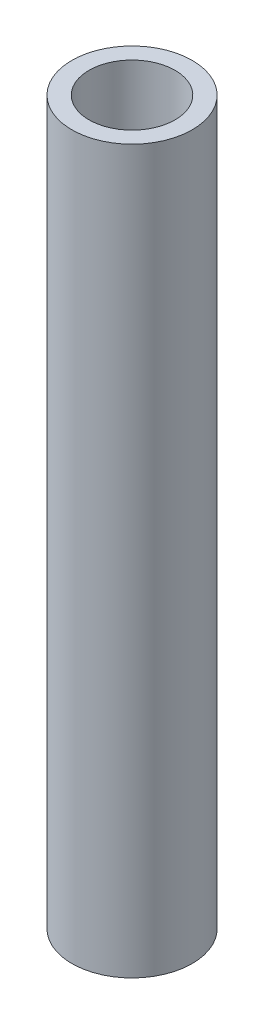
ISO-10303-21;
HEADER;
FILE_DESCRIPTION(('STEP AP214'),'2;1');
FILE_NAME('part.step','',(''),(''),'','','');
FILE_SCHEMA(('AUTOMOTIVE_DESIGN { 1 0 10303 214 1 1 1 1 }'));
ENDSEC;
DATA;
#1=APPLICATION_CONTEXT('core data for automotive mechanical design processes');
#2=APPLICATION_PROTOCOL_DEFINITION('international standard','automotive_design',2000,#1);
#3=PRODUCT_CONTEXT('',#1,'mechanical');
#4=PRODUCT('Part','Part','',(#3));
#5=PRODUCT_RELATED_PRODUCT_CATEGORY('part','',(#4));
#6=PRODUCT_DEFINITION_FORMATION('','',#4);
#7=PRODUCT_DEFINITION_CONTEXT('part definition',#1,'design');
#8=PRODUCT_DEFINITION('design','',#6,#7);
#9=PRODUCT_DEFINITION_SHAPE('','',#8);
#10=(LENGTH_UNIT() NAMED_UNIT(*) SI_UNIT(.MILLI.,.METRE.));
#11=(NAMED_UNIT(*) PLANE_ANGLE_UNIT() SI_UNIT($,.RADIAN.));
#12=(NAMED_UNIT(*) SI_UNIT($,.STERADIAN.) SOLID_ANGLE_UNIT());
#13=UNCERTAINTY_MEASURE_WITH_UNIT(LENGTH_MEASURE(1.E-05),#10,'distance_accuracy_value','');
#14=(GEOMETRIC_REPRESENTATION_CONTEXT(3) GLOBAL_UNCERTAINTY_ASSIGNED_CONTEXT((#13)) GLOBAL_UNIT_ASSIGNED_CONTEXT((#10,
#11,#12)) REPRESENTATION_CONTEXT('',''));
#15=CARTESIAN_POINT('',(0.,0.,0.));
#16=DIRECTION('',(0.,0.,1.));
#17=DIRECTION('',(1.,0.,0.));
#18=AXIS2_PLACEMENT_3D('',#15,#16,#17);
#19=CARTESIAN_POINT('',(0.,42.,0.));
#20=DIRECTION('',(0.,1.,0.));
#21=DIRECTION('',(0.,0.,1.));
#22=AXIS2_PLACEMENT_3D('',#19,#20,#21);
#23=PLANE('',#22);
#24=CARTESIAN_POINT('',(0.,42.,0.));
#25=DIRECTION('',(0.,1.,0.));
#26=DIRECTION('',(0.,0.,1.));
#27=AXIS2_PLACEMENT_3D('',#24,#25,#26);
#28=CIRCLE('',#27,3.5);
#29=CARTESIAN_POINT('',(0.,42.,-3.5));
#30=VERTEX_POINT('',#29);
#31=EDGE_CURVE('E10',#30,#30,#28,.T.);
#32=ORIENTED_EDGE('',*,*,#31,.T.);
#33=EDGE_LOOP('',(#32));
#34=FACE_BOUND('',#33,.T.);
#35=CARTESIAN_POINT('',(0.,42.,0.));
#36=DIRECTION('',(0.,1.,0.));
#37=DIRECTION('',(0.,0.,1.));
#38=AXIS2_PLACEMENT_3D('',#35,#36,#37);
#39=CIRCLE('',#38,2.5);
#40=CARTESIAN_POINT('',(0.,42.,-2.5));
#41=VERTEX_POINT('',#40);
#42=EDGE_CURVE('E42',#41,#41,#39,.T.);
#43=ORIENTED_EDGE('',*,*,#42,.F.);
#44=EDGE_LOOP('',(#43));
#45=FACE_BOUND('',#44,.T.);
#46=ADVANCED_FACE('F31',(#34,#45),#23,.T.);
#47=CARTESIAN_POINT('',(0.,0.,0.));
#48=DIRECTION('',(0.,1.,0.));
#49=DIRECTION('',(0.,0.,1.));
#50=AXIS2_PLACEMENT_3D('',#47,#48,#49);
#51=PLANE('',#50);
#52=CARTESIAN_POINT('',(0.,0.,0.));
#53=DIRECTION('',(0.,1.,0.));
#54=DIRECTION('',(0.,0.,1.));
#55=AXIS2_PLACEMENT_3D('',#52,#53,#54);
#56=CIRCLE('',#55,3.5);
#57=CARTESIAN_POINT('',(0.,0.,-3.5));
#58=VERTEX_POINT('',#57);
#59=EDGE_CURVE('E35',#58,#58,#56,.T.);
#60=ORIENTED_EDGE('',*,*,#59,.F.);
#61=EDGE_LOOP('',(#60));
#62=FACE_BOUND('',#61,.T.);
#63=CARTESIAN_POINT('',(0.,0.,0.));
#64=DIRECTION('',(0.,1.,0.));
#65=DIRECTION('',(0.,0.,1.));
#66=AXIS2_PLACEMENT_3D('',#63,#64,#65);
#67=CIRCLE('',#66,2.5);
#68=CARTESIAN_POINT('',(0.,0.,-2.5));
#69=VERTEX_POINT('',#68);
#70=EDGE_CURVE('E44',#69,#69,#67,.T.);
#71=ORIENTED_EDGE('',*,*,#70,.T.);
#72=EDGE_LOOP('',(#71));
#73=FACE_BOUND('',#72,.T.);
#74=ADVANCED_FACE('F54',(#62,#73),#51,.F.);
#75=CARTESIAN_POINT('',(0.,42.,0.));
#76=DIRECTION('',(0.,-1.,0.));
#77=DIRECTION('',(0.,0.,-1.));
#78=AXIS2_PLACEMENT_3D('',#75,#76,#77);
#79=CYLINDRICAL_SURFACE('',#78,3.5);
#80=CARTESIAN_POINT('',(0.,42.,-3.5));
#81=CARTESIAN_POINT('',(0.,41.5625,-3.5));
#82=CARTESIAN_POINT('',(0.,41.125,-3.5));
#83=CARTESIAN_POINT('',(0.,40.25,-3.5));
#84=CARTESIAN_POINT('',(0.,39.8125,-3.5));
#85=CARTESIAN_POINT('',(0.,38.9375,-3.5));
#86=CARTESIAN_POINT('',(0.,38.5,-3.5));
#87=CARTESIAN_POINT('',(0.,37.625,-3.5));
#88=CARTESIAN_POINT('',(0.,37.1875,-3.5));
#89=CARTESIAN_POINT('',(0.,36.3125,-3.5));
#90=CARTESIAN_POINT('',(0.,35.875,-3.5));
#91=CARTESIAN_POINT('',(0.,35.,-3.5));
#92=CARTESIAN_POINT('',(0.,34.5625,-3.5));
#93=CARTESIAN_POINT('',(0.,33.6875,-3.5));
#94=CARTESIAN_POINT('',(0.,33.25,-3.5));
#95=CARTESIAN_POINT('',(0.,32.375,-3.5));
#96=CARTESIAN_POINT('',(0.,31.9375,-3.5));
#97=CARTESIAN_POINT('',(0.,31.0625,-3.5));
#98=CARTESIAN_POINT('',(0.,30.625,-3.5));
#99=CARTESIAN_POINT('',(0.,29.75,-3.5));
#100=CARTESIAN_POINT('',(0.,29.3125,-3.5));
#101=CARTESIAN_POINT('',(0.,28.4375,-3.5));
#102=CARTESIAN_POINT('',(0.,28.,-3.5));
#103=CARTESIAN_POINT('',(0.,27.125,-3.5));
#104=CARTESIAN_POINT('',(0.,26.6875,-3.5));
#105=CARTESIAN_POINT('',(0.,25.8125,-3.5));
#106=CARTESIAN_POINT('',(0.,25.375,-3.5));
#107=CARTESIAN_POINT('',(0.,24.5,-3.5));
#108=CARTESIAN_POINT('',(0.,24.0625,-3.5));
#109=CARTESIAN_POINT('',(0.,23.1875,-3.5));
#110=CARTESIAN_POINT('',(0.,22.75,-3.5));
#111=CARTESIAN_POINT('',(0.,21.875,-3.5));
#112=CARTESIAN_POINT('',(0.,21.4375,-3.5));
#113=CARTESIAN_POINT('',(0.,20.5625,-3.5));
#114=CARTESIAN_POINT('',(0.,20.125,-3.5));
#115=CARTESIAN_POINT('',(0.,19.25,-3.5));
#116=CARTESIAN_POINT('',(0.,18.8125,-3.5));
#117=CARTESIAN_POINT('',(0.,17.9375,-3.5));
#118=CARTESIAN_POINT('',(0.,17.5,-3.5));
#119=CARTESIAN_POINT('',(0.,16.625,-3.5));
#120=CARTESIAN_POINT('',(0.,16.1875,-3.5));
#121=CARTESIAN_POINT('',(0.,15.3125,-3.5));
#122=CARTESIAN_POINT('',(0.,14.875,-3.5));
#123=CARTESIAN_POINT('',(0.,14.,-3.5));
#124=CARTESIAN_POINT('',(0.,13.5625,-3.5));
#125=CARTESIAN_POINT('',(0.,12.6875,-3.5));
#126=CARTESIAN_POINT('',(0.,12.25,-3.5));
#127=CARTESIAN_POINT('',(0.,11.375,-3.5));
#128=CARTESIAN_POINT('',(0.,10.9375,-3.5));
#129=CARTESIAN_POINT('',(0.,10.0625,-3.5));
#130=CARTESIAN_POINT('',(0.,9.625,-3.5));
#131=CARTESIAN_POINT('',(0.,8.75,-3.5));
#132=CARTESIAN_POINT('',(0.,8.3125,-3.5));
#133=CARTESIAN_POINT('',(0.,7.4375,-3.5));
#134=CARTESIAN_POINT('',(0.,7.,-3.5));
#135=CARTESIAN_POINT('',(0.,6.125,-3.5));
#136=CARTESIAN_POINT('',(0.,5.6875,-3.5));
#137=CARTESIAN_POINT('',(0.,4.8125,-3.5));
#138=CARTESIAN_POINT('',(0.,4.375,-3.5));
#139=CARTESIAN_POINT('',(0.,3.5,-3.5));
#140=CARTESIAN_POINT('',(0.,3.0625,-3.5));
#141=CARTESIAN_POINT('',(0.,2.1875,-3.5));
#142=CARTESIAN_POINT('',(0.,1.75,-3.5));
#143=CARTESIAN_POINT('',(0.,0.875000000000001,-3.5));
#144=CARTESIAN_POINT('',(0.,0.4375,-3.5));
#145=CARTESIAN_POINT('',(0.,0.,-3.5));
#146=B_SPLINE_CURVE_WITH_KNOTS('',3,(#80,#81,#82,#83,#84,#85,#86,#87,#88,#89,#90,#91,#92,#93,
#94,#95,#96,#97,#98,#99,#100,#101,#102,#103,#104,#105,#106,#107,#108,#109,#110,#111,#112,#113,
#114,#115,#116,#117,#118,#119,#120,#121,#122,#123,#124,#125,#126,#127,#128,#129,#130,#131,#132,
#133,#134,#135,#136,#137,#138,#139,#140,#141,#142,#143,#144,#145),.UNSPECIFIED.,.F.,.F.,(4,2,2,
2,2,2,2,2,2,2,2,2,2,2,2,2,2,2,2,2,2,2,2,2,2,2,2,2,2,2,2,2,4),(0.,1.31249999999999,2.625,3.9375,
5.25,6.5625,7.87499999999999,9.18749999999999,10.5,11.8125,13.125,14.4375,15.75,17.0625,18.375,
19.6875,21.,22.3125,23.625,24.9375,26.25,27.5625,28.875,30.1875,31.5,32.8125,34.125,35.4375,
36.75,38.0625,39.375,40.6875,42.),.UNSPECIFIED.);
#147=EDGE_CURVE('BSEAM33',#30,#58,#146,.T.);
#148=ORIENTED_EDGE('',*,*,#31,.F.);
#149=ORIENTED_EDGE('',*,*,#59,.T.);
#150=ORIENTED_EDGE('',*,*,#147,.T.);
#151=ORIENTED_EDGE('',*,*,#147,.F.);
#152=EDGE_LOOP('',(#148,#150,#149,#151));
#153=FACE_BOUND('',#152,.T.);
#154=ADVANCED_FACE('F33',(#153),#79,.T.);
#155=CARTESIAN_POINT('',(0.,42.,0.));
#156=DIRECTION('',(0.,-1.,0.));
#157=DIRECTION('',(0.,0.,-1.));
#158=AXIS2_PLACEMENT_3D('',#155,#156,#157);
#159=CYLINDRICAL_SURFACE('',#158,2.5);
#160=CARTESIAN_POINT('',(0.,42.,-2.5));
#161=CARTESIAN_POINT('',(0.,41.5625,-2.5));
#162=CARTESIAN_POINT('',(0.,41.125,-2.5));
#163=CARTESIAN_POINT('',(0.,40.25,-2.5));
#164=CARTESIAN_POINT('',(0.,39.8125,-2.5));
#165=CARTESIAN_POINT('',(0.,38.9375,-2.5));
#166=CARTESIAN_POINT('',(0.,38.5,-2.5));
#167=CARTESIAN_POINT('',(0.,37.625,-2.5));
#168=CARTESIAN_POINT('',(0.,37.1875,-2.5));
#169=CARTESIAN_POINT('',(0.,36.3125,-2.5));
#170=CARTESIAN_POINT('',(0.,35.875,-2.5));
#171=CARTESIAN_POINT('',(0.,35.,-2.5));
#172=CARTESIAN_POINT('',(0.,34.5625,-2.5));
#173=CARTESIAN_POINT('',(0.,33.6875,-2.5));
#174=CARTESIAN_POINT('',(0.,33.25,-2.5));
#175=CARTESIAN_POINT('',(0.,32.375,-2.5));
#176=CARTESIAN_POINT('',(0.,31.9375,-2.5));
#177=CARTESIAN_POINT('',(0.,31.0625,-2.5));
#178=CARTESIAN_POINT('',(0.,30.625,-2.5));
#179=CARTESIAN_POINT('',(0.,29.75,-2.5));
#180=CARTESIAN_POINT('',(0.,29.3125,-2.5));
#181=CARTESIAN_POINT('',(0.,28.4375,-2.5));
#182=CARTESIAN_POINT('',(0.,28.,-2.5));
#183=CARTESIAN_POINT('',(0.,27.125,-2.5));
#184=CARTESIAN_POINT('',(0.,26.6875,-2.5));
#185=CARTESIAN_POINT('',(0.,25.8125,-2.5));
#186=CARTESIAN_POINT('',(0.,25.375,-2.5));
#187=CARTESIAN_POINT('',(0.,24.5,-2.5));
#188=CARTESIAN_POINT('',(0.,24.0625,-2.5));
#189=CARTESIAN_POINT('',(0.,23.1875,-2.5));
#190=CARTESIAN_POINT('',(0.,22.75,-2.5));
#191=CARTESIAN_POINT('',(0.,21.875,-2.5));
#192=CARTESIAN_POINT('',(0.,21.4375,-2.5));
#193=CARTESIAN_POINT('',(0.,20.5625,-2.5));
#194=CARTESIAN_POINT('',(0.,20.125,-2.5));
#195=CARTESIAN_POINT('',(0.,19.25,-2.5));
#196=CARTESIAN_POINT('',(0.,18.8125,-2.5));
#197=CARTESIAN_POINT('',(0.,17.9375,-2.5));
#198=CARTESIAN_POINT('',(0.,17.5,-2.5));
#199=CARTESIAN_POINT('',(0.,16.625,-2.5));
#200=CARTESIAN_POINT('',(0.,16.1875,-2.5));
#201=CARTESIAN_POINT('',(0.,15.3125,-2.5));
#202=CARTESIAN_POINT('',(0.,14.875,-2.5));
#203=CARTESIAN_POINT('',(0.,14.,-2.5));
#204=CARTESIAN_POINT('',(0.,13.5625,-2.5));
#205=CARTESIAN_POINT('',(0.,12.6875,-2.5));
#206=CARTESIAN_POINT('',(0.,12.25,-2.5));
#207=CARTESIAN_POINT('',(0.,11.375,-2.5));
#208=CARTESIAN_POINT('',(0.,10.9375,-2.5));
#209=CARTESIAN_POINT('',(0.,10.0625,-2.5));
#210=CARTESIAN_POINT('',(0.,9.625,-2.5));
#211=CARTESIAN_POINT('',(0.,8.75,-2.5));
#212=CARTESIAN_POINT('',(0.,8.3125,-2.5));
#213=CARTESIAN_POINT('',(0.,7.4375,-2.5));
#214=CARTESIAN_POINT('',(0.,7.,-2.5));
#215=CARTESIAN_POINT('',(0.,6.125,-2.5));
#216=CARTESIAN_POINT('',(0.,5.6875,-2.5));
#217=CARTESIAN_POINT('',(0.,4.8125,-2.5));
#218=CARTESIAN_POINT('',(0.,4.375,-2.5));
#219=CARTESIAN_POINT('',(0.,3.5,-2.5));
#220=CARTESIAN_POINT('',(0.,3.0625,-2.5));
#221=CARTESIAN_POINT('',(0.,2.1875,-2.5));
#222=CARTESIAN_POINT('',(0.,1.75,-2.5));
#223=CARTESIAN_POINT('',(0.,0.875000000000001,-2.5));
#224=CARTESIAN_POINT('',(0.,0.4375,-2.5));
#225=CARTESIAN_POINT('',(0.,0.,-2.5));
#226=B_SPLINE_CURVE_WITH_KNOTS('',3,(#160,#161,#162,#163,#164,#165,#166,#167,#168,#169,#170,
#171,#172,#173,#174,#175,#176,#177,#178,#179,#180,#181,#182,#183,#184,#185,#186,#187,#188,#189,
#190,#191,#192,#193,#194,#195,#196,#197,#198,#199,#200,#201,#202,#203,#204,#205,#206,#207,#208,
#209,#210,#211,#212,#213,#214,#215,#216,#217,#218,#219,#220,#221,#222,#223,#224,#225),
.UNSPECIFIED.,.F.,.F.,(4,2,2,2,2,2,2,2,2,2,2,2,2,2,2,2,2,2,2,2,2,2,2,2,2,2,2,2,2,2,2,2,4),(0.,
1.3125,2.625,3.9375,5.25,6.56250000000001,7.875,9.1875,10.5,11.8125,13.125,14.4375,15.75,
17.0625,18.375,19.6875,21.,22.3125,23.625,24.9375,26.25,27.5625,28.875,30.1875,31.5,32.8125,
34.125,35.4375,36.75,38.0625,39.375,40.6875,42.),.UNSPECIFIED.);
#227=EDGE_CURVE('BSEAM50',#41,#69,#226,.T.);
#228=ORIENTED_EDGE('',*,*,#42,.T.);
#229=ORIENTED_EDGE('',*,*,#70,.F.);
#230=ORIENTED_EDGE('',*,*,#227,.T.);
#231=ORIENTED_EDGE('',*,*,#227,.F.);
#232=EDGE_LOOP('',(#228,#230,#229,#231));
#233=FACE_BOUND('',#232,.T.);
#234=ADVANCED_FACE('F50',(#233),#159,.F.);
#235=CLOSED_SHELL('',(#46,#74,#154,#234));
#236=MANIFOLD_SOLID_BREP('B2',#235);
#237=ADVANCED_BREP_SHAPE_REPRESENTATION('',(#18,#236),#14);
#238=SHAPE_DEFINITION_REPRESENTATION(#9,#237);
ENDSEC;
END-ISO-10303-21;
